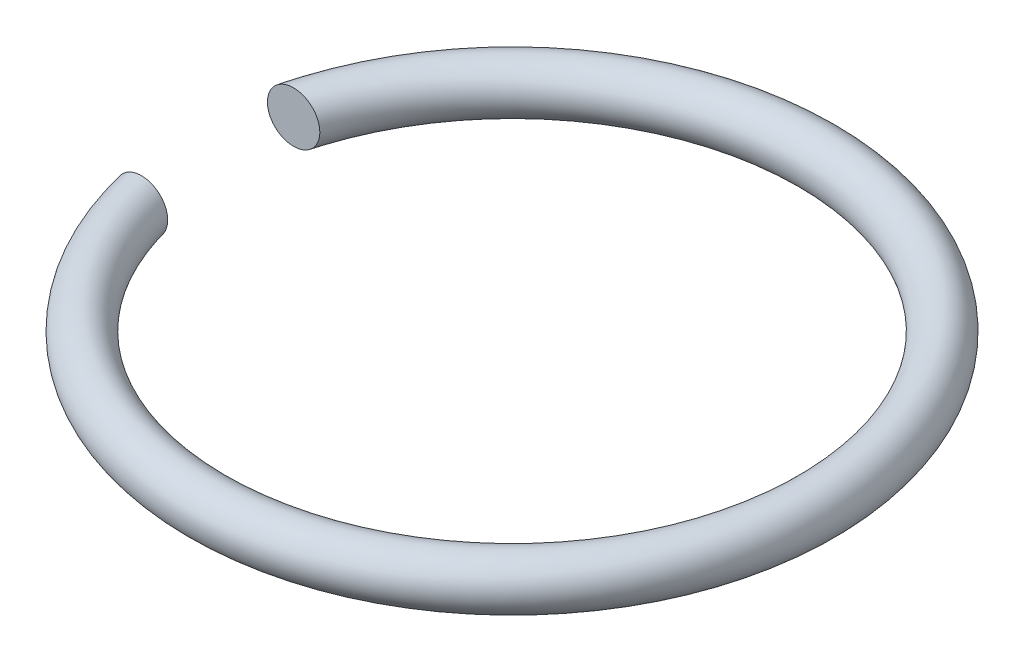
ISO-10303-21;
HEADER;
FILE_DESCRIPTION(('STEP AP214'),'2;1');
FILE_NAME('part.step','',(''),(''),'','','');
FILE_SCHEMA(('AUTOMOTIVE_DESIGN { 1 0 10303 214 1 1 1 1 }'));
ENDSEC;
DATA;
#1=APPLICATION_CONTEXT('core data for automotive mechanical design processes');
#2=APPLICATION_PROTOCOL_DEFINITION('international standard','automotive_design',2000,#1);
#3=PRODUCT_CONTEXT('',#1,'mechanical');
#4=PRODUCT('Part','Part','',(#3));
#5=PRODUCT_RELATED_PRODUCT_CATEGORY('part','',(#4));
#6=PRODUCT_DEFINITION_FORMATION('','',#4);
#7=PRODUCT_DEFINITION_CONTEXT('part definition',#1,'design');
#8=PRODUCT_DEFINITION('design','',#6,#7);
#9=PRODUCT_DEFINITION_SHAPE('','',#8);
#10=(LENGTH_UNIT() NAMED_UNIT(*) SI_UNIT(.MILLI.,.METRE.));
#11=(NAMED_UNIT(*) PLANE_ANGLE_UNIT() SI_UNIT($,.RADIAN.));
#12=(NAMED_UNIT(*) SI_UNIT($,.STERADIAN.) SOLID_ANGLE_UNIT());
#13=UNCERTAINTY_MEASURE_WITH_UNIT(LENGTH_MEASURE(1.E-05),#10,'distance_accuracy_value','');
#14=(GEOMETRIC_REPRESENTATION_CONTEXT(3) GLOBAL_UNCERTAINTY_ASSIGNED_CONTEXT((#13)) GLOBAL_UNIT_ASSIGNED_CONTEXT((#10,
#11,#12)) REPRESENTATION_CONTEXT('',''));
#15=CARTESIAN_POINT('',(0.,0.,0.));
#16=DIRECTION('',(0.,0.,1.));
#17=DIRECTION('',(1.,0.,0.));
#18=AXIS2_PLACEMENT_3D('',#15,#16,#17);
#19=CARTESIAN_POINT('',(0.,1.,0.));
#20=DIRECTION('',(0.,-1.,0.));
#21=DIRECTION('',(0.,0.,-1.));
#22=AXIS2_PLACEMENT_3D('',#19,#20,#21);
#23=TOROIDAL_SURFACE('',#22,12.,1.);
#24=CARTESIAN_POINT('',(-12.5331257529316,0.538564025143771,-3.));
#25=CARTESIAN_POINT('',(-12.5590403209402,0.587024351642073,-3.));
#26=CARTESIAN_POINT('',(-12.5809248498942,0.637679552930905,-3.));
#27=CARTESIAN_POINT('',(-12.6159108635897,0.741978383059094,-3.));
#28=CARTESIAN_POINT('',(-12.6290039189024,0.795624826745747,-3.));
#29=CARTESIAN_POINT('',(-12.6459590840785,0.904362375604501,-3.));
#30=CARTESIAN_POINT('',(-12.6498213584714,0.959453455009694,-3.));
#31=CARTESIAN_POINT('',(-12.6481847627329,1.06948383182448,-3.));
#32=CARTESIAN_POINT('',(-12.6426878528948,1.12442315860485,-3.));
#33=CARTESIAN_POINT('',(-12.6225703188871,1.23231278659919,-3.));
#34=CARTESIAN_POINT('',(-12.6079962257925,1.28527178062763,-3.));
#35=CARTESIAN_POINT('',(-12.5702335556913,1.38802162412066,-3.));
#36=CARTESIAN_POINT('',(-12.5470445812378,1.43781232729226,-3.));
#37=CARTESIAN_POINT('',(-12.4925523272459,1.53327398817487,-3.));
#38=CARTESIAN_POINT('',(-12.4611841154482,1.57890784528632,-3.));
#39=CARTESIAN_POINT('',(-12.3913829332014,1.66440323654897,-3.));
#40=CARTESIAN_POINT('',(-12.3529493202959,1.70426424518568,-3.));
#41=CARTESIAN_POINT('',(-12.2692361030307,1.77802478839521,-3.));
#42=CARTESIAN_POINT('',(-12.2238260453012,1.81177619869483,-3.));
#43=CARTESIAN_POINT('',(-12.1281114876813,1.87142000458535,-3.));
#44=CARTESIAN_POINT('',(-12.0778063279946,1.89731133879672,-3.));
#45=CARTESIAN_POINT('',(-11.9722240045152,1.94126435548802,-3.));
#46=CARTESIAN_POINT('',(-11.9168470010149,1.95908623811196,-3.));
#47=CARTESIAN_POINT('',(-11.8039227989682,1.98542680649967,-3.));
#48=CARTESIAN_POINT('',(-11.7463752943074,1.99394417489706,-3.));
#49=CARTESIAN_POINT('',(-11.629251301924,2.00160392759814,-3.));
#50=CARTESIAN_POINT('',(-11.569659496973,2.000513396032,-3.));
#51=CARTESIAN_POINT('',(-11.4514809968281,1.98845058812705,-3.));
#52=CARTESIAN_POINT('',(-11.3928943937598,1.97747741093395,-3.));
#53=CARTESIAN_POINT('',(-11.2777990899351,1.94576345175339,-3.));
#54=CARTESIAN_POINT('',(-11.2213165523849,1.92492748907891,-3.));
#55=CARTESIAN_POINT('',(-11.1127064394005,1.8739609294875,-3.));
#56=CARTESIAN_POINT('',(-11.0605787630071,1.84383054812028,-3.));
#57=CARTESIAN_POINT('',(-10.9628683889453,1.77543792917345,-3.));
#58=CARTESIAN_POINT('',(-10.9172159280117,1.73727549491326,-3.));
#59=CARTESIAN_POINT('',(-10.8332199479625,1.65360652237477,-3.));
#60=CARTESIAN_POINT('',(-10.7948751763221,1.60810124512011,-3.));
#61=CARTESIAN_POINT('',(-10.7278892123072,1.51253154863733,-3.));
#62=CARTESIAN_POINT('',(-10.6989838945527,1.46265235838512,-3.));
#63=CARTESIAN_POINT('',(-10.6503180453021,1.35861562279044,-3.));
#64=CARTESIAN_POINT('',(-10.630555371398,1.30445908325085,-3.));
#65=CARTESIAN_POINT('',(-10.6014436982164,1.19549103542389,-3.));
#66=CARTESIAN_POINT('',(-10.5917478979029,1.1407720421181,-3.));
#67=CARTESIAN_POINT('',(-10.5818976213653,1.03048456169354,-3.));
#68=CARTESIAN_POINT('',(-10.5817417262143,0.974916202135886,-3.));
#69=CARTESIAN_POINT('',(-10.5908772572165,0.865731797491081,-3.));
#70=CARTESIAN_POINT('',(-10.5999724103178,0.812099179140915,-3.));
#71=CARTESIAN_POINT('',(-10.6269922650117,0.707110581953126,-3.));
#72=CARTESIAN_POINT('',(-10.6449169653607,0.655754602794872,-3.));
#73=CARTESIAN_POINT('',(-10.6891112401839,0.55643980325137,-3.));
#74=CARTESIAN_POINT('',(-10.7154257263261,0.50850100555278,-3.));
#75=CARTESIAN_POINT('',(-10.7755216600191,0.417562682879672,-3.));
#76=CARTESIAN_POINT('',(-10.8093039889832,0.374563741856894,-3.));
#77=CARTESIAN_POINT('',(-10.8843532193456,0.293426617081652,-3.));
#78=CARTESIAN_POINT('',(-10.9258022174198,0.255456966923196,-3.));
#79=CARTESIAN_POINT('',(-11.0142968422612,0.186726943183234,-3.));
#80=CARTESIAN_POINT('',(-11.0613434550837,0.155967842628459,-3.));
#81=CARTESIAN_POINT('',(-11.1614876733888,0.101394993203649,-3.));
#82=CARTESIAN_POINT('',(-11.2147407593445,0.0778664362493279,-3.));
#83=CARTESIAN_POINT('',(-11.3243748965824,0.0398201074087318,-3.));
#84=CARTESIAN_POINT('',(-11.3807564358215,0.0253037455173017,-3.));
#85=CARTESIAN_POINT('',(-11.496645063015,0.00536001221086368,-3.));
#86=CARTESIAN_POINT('',(-11.5561953741981,0.000183004025686742,-3.));
#87=CARTESIAN_POINT('',(-11.6753273196469,-0.00017347190107423,-3.));
#88=CARTESIAN_POINT('',(-11.7349089548287,0.00464737113878986,-3.));
#89=CARTESIAN_POINT('',(-11.8528029240899,0.0242683084487208,-3.));
#90=CARTESIAN_POINT('',(-11.9111047261329,0.0391319164279861,-3.));
#91=CARTESIAN_POINT('',(-12.0243436184654,0.0785810414067205,-3.));
#92=CARTESIAN_POINT('',(-12.0792800445442,0.103168470463628,-3.));
#93=CARTESIAN_POINT('',(-12.183362788232,0.16105309985609,-3.));
#94=CARTESIAN_POINT('',(-12.2325784356186,0.194225668028035,-3.));
#95=CARTESIAN_POINT('',(-12.3244941664947,0.268553765860749,-3.));
#96=CARTESIAN_POINT('',(-12.3672030895873,0.309698289449069,-3.));
#97=CARTESIAN_POINT('',(-12.4305169909435,0.382453148028477,-3.));
#98=CARTESIAN_POINT('',(-12.4534891285524,0.412037469028751,-3.));
#99=CARTESIAN_POINT('',(-12.4959720204228,0.473596794595811,-3.));
#100=CARTESIAN_POINT('',(-12.515482853072,0.505571744998915,-3.));
#101=CARTESIAN_POINT('',(-12.5331257529316,0.538564025143771,-3.));
#102=B_SPLINE_CURVE_WITH_KNOTS('',3,(#24,#25,#26,#27,#28,#29,#30,#31,#32,#33,#34,#35,#36,#37,
#38,#39,#40,#41,#42,#43,#44,#45,#46,#47,#48,#49,#50,#51,#52,#53,#54,#55,#56,#57,#58,#59,#60,#61,
#62,#63,#64,#65,#66,#67,#68,#69,#70,#71,#72,#73,#74,#75,#76,#77,#78,#79,#80,#81,#82,#83,#84,#85,
#86,#87,#88,#89,#90,#91,#92,#93,#94,#95,#96,#97,#98,#99,#100,#101),.UNSPECIFIED.,.T.,.F.,(4,2,2,
2,2,2,2,2,2,2,2,2,2,2,2,2,2,2,2,2,2,2,2,2,2,2,2,2,2,2,2,2,2,2,2,2,2,2,4),(0.,0.164728565401731,
0.329614850936996,0.494498197513969,0.659347013305251,0.823357665300658,0.987375884853888,
1.15273808219301,1.31811532335022,1.48708103854134,1.65606955975396,1.82979469067665,
2.00354441503808,2.18151757711933,2.35950696401742,2.53925018788098,2.71898924357774,
2.89661445146273,3.07420918727266,3.24629451637917,3.41833950004743,3.58423826977248,
3.75011236432578,3.91253915538504,4.07496592356873,4.23827721034716,4.40160778270409,
4.56948284643276,4.73738752631733,4.91125039033289,5.08514044905544,5.26362643757258,
5.44211797437847,5.62174904875814,5.80141546272703,5.97860717119806,6.15555597003323,
6.26770738273673,6.37985625523317),.UNSPECIFIED.);
#103=CARTESIAN_POINT('',(-12.5331257529316,0.538564025143771,-3.));
#104=VERTEX_POINT('',#103);
#105=EDGE_CURVE('E10',#104,#104,#102,.T.);
#106=ORIENTED_EDGE('',*,*,#105,.T.);
#107=EDGE_LOOP('',(#106));
#108=FACE_BOUND('',#107,.T.);
#109=CARTESIAN_POINT('',(-12.5331257529316,0.538564025143771,3.));
#110=CARTESIAN_POINT('',(-12.5063839431264,0.488567934981469,3.));
#111=CARTESIAN_POINT('',(-12.475311100351,0.440833961622948,3.));
#112=CARTESIAN_POINT('',(-12.4055089849785,0.351268574648292,3.));
#113=CARTESIAN_POINT('',(-12.3667683493233,0.309446080971254,3.));
#114=CARTESIAN_POINT('',(-12.2829210083178,0.232917373377969,3.));
#115=CARTESIAN_POINT('',(-12.2378249588529,0.198199481606336,3.));
#116=CARTESIAN_POINT('',(-12.1425625224716,0.136656276218397,3.));
#117=CARTESIAN_POINT('',(-12.0923973688503,0.109829049013358,3.));
#118=CARTESIAN_POINT('',(-11.9872901276241,0.0641841664443189,3.));
#119=CARTESIAN_POINT('',(-11.9322697710838,0.0455468036473215,3.));
#120=CARTESIAN_POINT('',(-11.819918810363,0.0175221181121004,3.));
#121=CARTESIAN_POINT('',(-11.762587781582,0.00813650358193379,3.));
#122=CARTESIAN_POINT('',(-11.6457275412966,-0.00131568394537378,3.));
#123=CARTESIAN_POINT('',(-11.5861790814982,-0.00114528490947901,3.));
#124=CARTESIAN_POINT('',(-11.4679324955061,0.00907382685729364,3.));
#125=CARTESIAN_POINT('',(-11.4092344500842,0.0191234717516931,3.));
#126=CARTESIAN_POINT('',(-11.2937066739075,0.0490121439297842,3.));
#127=CARTESIAN_POINT('',(-11.2369037639005,0.0689551021531345,3.));
#128=CARTESIAN_POINT('',(-11.127500382714,0.118192770815867,3.));
#129=CARTESIAN_POINT('',(-11.0748998305882,0.147487301070021,3.));
#130=CARTESIAN_POINT('',(-10.976050690112,0.214334173804583,3.));
#131=CARTESIAN_POINT('',(-10.9297400983881,0.251794702431066,3.));
#132=CARTESIAN_POINT('',(-10.8443100266203,0.334179714370609,3.));
#133=CARTESIAN_POINT('',(-10.8051893683285,0.379102972430151,3.));
#134=CARTESIAN_POINT('',(-10.7365567494035,0.473698667229044,3.));
#135=CARTESIAN_POINT('',(-10.7067890983029,0.523185481751105,3.));
#136=CARTESIAN_POINT('',(-10.6563454034567,0.626594877428182,3.));
#137=CARTESIAN_POINT('',(-10.6356672196139,0.680516410884298,3.));
#138=CARTESIAN_POINT('',(-10.6047413534005,0.789174431027502,3.));
#139=CARTESIAN_POINT('',(-10.594145396956,0.843811920236408,3.));
#140=CARTESIAN_POINT('',(-10.5825050996864,0.954092525643978,3.));
#141=CARTESIAN_POINT('',(-10.5814592808966,1.00973548490209,3.));
#142=CARTESIAN_POINT('',(-10.5888722454725,1.11915672521979,3.));
#143=CARTESIAN_POINT('',(-10.5971239678855,1.17294919119995,3.));
#144=CARTESIAN_POINT('',(-10.6225070891624,1.27839229127178,3.));
#145=CARTESIAN_POINT('',(-10.6396384231622,1.33004294100611,3.));
#146=CARTESIAN_POINT('',(-10.682288915287,1.43000589279063,3.));
#147=CARTESIAN_POINT('',(-10.7078429641199,1.4783032791148,3.));
#148=CARTESIAN_POINT('',(-10.7664925516323,1.5700736315448,3.));
#149=CARTESIAN_POINT('',(-10.7995889565361,1.6135460426585,3.));
#150=CARTESIAN_POINT('',(-10.8733105519817,1.69571171266243,3.));
#151=CARTESIAN_POINT('',(-10.9141152214863,1.73424383437309,3.));
#152=CARTESIAN_POINT('',(-11.0014204666303,1.80419560070073,3.));
#153=CARTESIAN_POINT('',(-11.0479220287776,1.83561401077439,3.));
#154=CARTESIAN_POINT('',(-11.1470711722753,1.8916123403089,3.));
#155=CARTESIAN_POINT('',(-11.1998783904251,1.91590971740971,3.));
#156=CARTESIAN_POINT('',(-11.3087502454762,1.95556297817086,3.));
#157=CARTESIAN_POINT('',(-11.3648153961327,1.97091744736051,3.));
#158=CARTESIAN_POINT('',(-11.480244331425,1.99261998254586,3.));
#159=CARTESIAN_POINT('',(-11.5396563455337,1.99871226668219,3.));
#160=CARTESIAN_POINT('',(-11.6586688764014,2.00092066788262,3.));
#161=CARTESIAN_POINT('',(-11.7182694064768,1.9970360637326,3.));
#162=CARTESIAN_POINT('',(-11.8364289370666,1.9792818351759,3.));
#163=CARTESIAN_POINT('',(-11.8949767408866,1.9653373740439,3.));
#164=CARTESIAN_POINT('',(-12.0088489543031,1.92768499460048,3.));
#165=CARTESIAN_POINT('',(-12.0641735055194,1.90397750561657,3.));
#166=CARTESIAN_POINT('',(-12.1692016440254,1.84775672735468,3.));
#167=CARTESIAN_POINT('',(-12.2189706913483,1.81536585974889,3.));
#168=CARTESIAN_POINT('',(-12.3121712207287,1.74247490294558,3.));
#169=CARTESIAN_POINT('',(-12.3556035949193,1.70197595718368,3.));
#170=CARTESIAN_POINT('',(-12.4336503212693,1.6151627468397,3.));
#171=CARTESIAN_POINT('',(-12.4684683245513,1.56903160815427,3.));
#172=CARTESIAN_POINT('',(-12.5296011047771,1.47144380755518,3.));
#173=CARTESIAN_POINT('',(-12.555917658763,1.41998826156528,3.));
#174=CARTESIAN_POINT('',(-12.5985489540598,1.31476103522195,3.));
#175=CARTESIAN_POINT('',(-12.6151222544545,1.26109402462551,3.));
#176=CARTESIAN_POINT('',(-12.6388390574823,1.15169989483361,3.));
#177=CARTESIAN_POINT('',(-12.6459812131994,1.09597248254838,3.));
#178=CARTESIAN_POINT('',(-12.6505498953641,0.985122554146665,3.));
#179=CARTESIAN_POINT('',(-12.6481467793423,0.930006881303503,3.));
#180=CARTESIAN_POINT('',(-12.6340852936577,0.821020271487192,3.));
#181=CARTESIAN_POINT('',(-12.6224391266415,0.767147789689244,3.));
#182=CARTESIAN_POINT('',(-12.5970652041213,0.684216054244473,3.));
#183=CARTESIAN_POINT('',(-12.5862613988178,0.654230257402178,3.));
#184=CARTESIAN_POINT('',(-12.5618024801117,0.595446401707357,3.));
#185=CARTESIAN_POINT('',(-12.5481474243893,0.566648318841722,3.));
#186=CARTESIAN_POINT('',(-12.5331257529316,0.538564025143771,3.));
#187=B_SPLINE_CURVE_WITH_KNOTS('',3,(#109,#110,#111,#112,#113,#114,#115,#116,#117,#118,#119,
#120,#121,#122,#123,#124,#125,#126,#127,#128,#129,#130,#131,#132,#133,#134,#135,#136,#137,#138,
#139,#140,#141,#142,#143,#144,#145,#146,#147,#148,#149,#150,#151,#152,#153,#154,#155,#156,#157,
#158,#159,#160,#161,#162,#163,#164,#165,#166,#167,#168,#169,#170,#171,#172,#173,#174,#175,#176,
#177,#178,#179,#180,#181,#182,#183,#184,#185,#186),.UNSPECIFIED.,.T.,.F.,(4,2,2,2,2,2,2,2,2,2,2,
2,2,2,2,2,2,2,2,2,2,2,2,2,2,2,2,2,2,2,2,2,2,2,2,2,2,2,4),(0.,0.169975704397589,
0.340205211090697,0.510152622858043,0.680058786122547,0.853537827544259,1.0270488934885,
1.20486458150819,1.38269704906868,1.56243854896806,1.74217658583378,1.91998937582613,
2.09777300077711,2.27015840023313,2.44250319011948,2.60865175928177,2.77477461511043,
2.93726971162809,3.09976362116097,3.26293929638833,3.42613372146688,3.59374375121282,
3.76138284644863,3.93497647302236,4.10859754888504,4.28693137632116,4.46527809560199,
4.64496542612819,4.82464485577809,5.00191340235186,5.1791569673495,5.35169068049898,
5.52418830587793,5.69187337730887,5.85958239422137,6.02431182281643,6.18882413717355,
6.28430648691078,6.37978690524592),.UNSPECIFIED.);
#188=CARTESIAN_POINT('',(-12.5331257529316,0.538564025143771,3.));
#189=VERTEX_POINT('',#188);
#190=EDGE_CURVE('E43',#189,#189,#187,.T.);
#191=ORIENTED_EDGE('',*,*,#190,.T.);
#192=EDGE_LOOP('',(#191));
#193=FACE_BOUND('',#192,.T.);
#194=ADVANCED_FACE('F32',(#108,#193),#23,.T.);
#195=CARTESIAN_POINT('',(-18.6099940128912,-1.2E-05,3.));
#196=DIRECTION('',(0.,0.,1.));
#197=DIRECTION('',(1.,0.,0.));
#198=AXIS2_PLACEMENT_3D('',#195,#196,#197);
#199=PLANE('',#198);
#200=ORIENTED_EDGE('',*,*,#190,.F.);
#201=EDGE_LOOP('',(#200));
#202=FACE_BOUND('',#201,.T.);
#203=ADVANCED_FACE('F52',(#202),#199,.F.);
#204=CARTESIAN_POINT('',(-18.6099940128912,-1.2E-05,-3.));
#205=DIRECTION('',(0.,0.,-1.));
#206=DIRECTION('',(-1.,0.,0.));
#207=AXIS2_PLACEMENT_3D('',#204,#205,#206);
#208=PLANE('',#207);
#209=ORIENTED_EDGE('',*,*,#105,.F.);
#210=EDGE_LOOP('',(#209));
#211=FACE_BOUND('',#210,.T.);
#212=ADVANCED_FACE('F55',(#211),#208,.F.);
#213=CLOSED_SHELL('',(#194,#203,#212));
#214=MANIFOLD_SOLID_BREP('B2',#213);
#215=ADVANCED_BREP_SHAPE_REPRESENTATION('',(#18,#214),#14);
#216=SHAPE_DEFINITION_REPRESENTATION(#9,#215);
ENDSEC;
END-ISO-10303-21;
